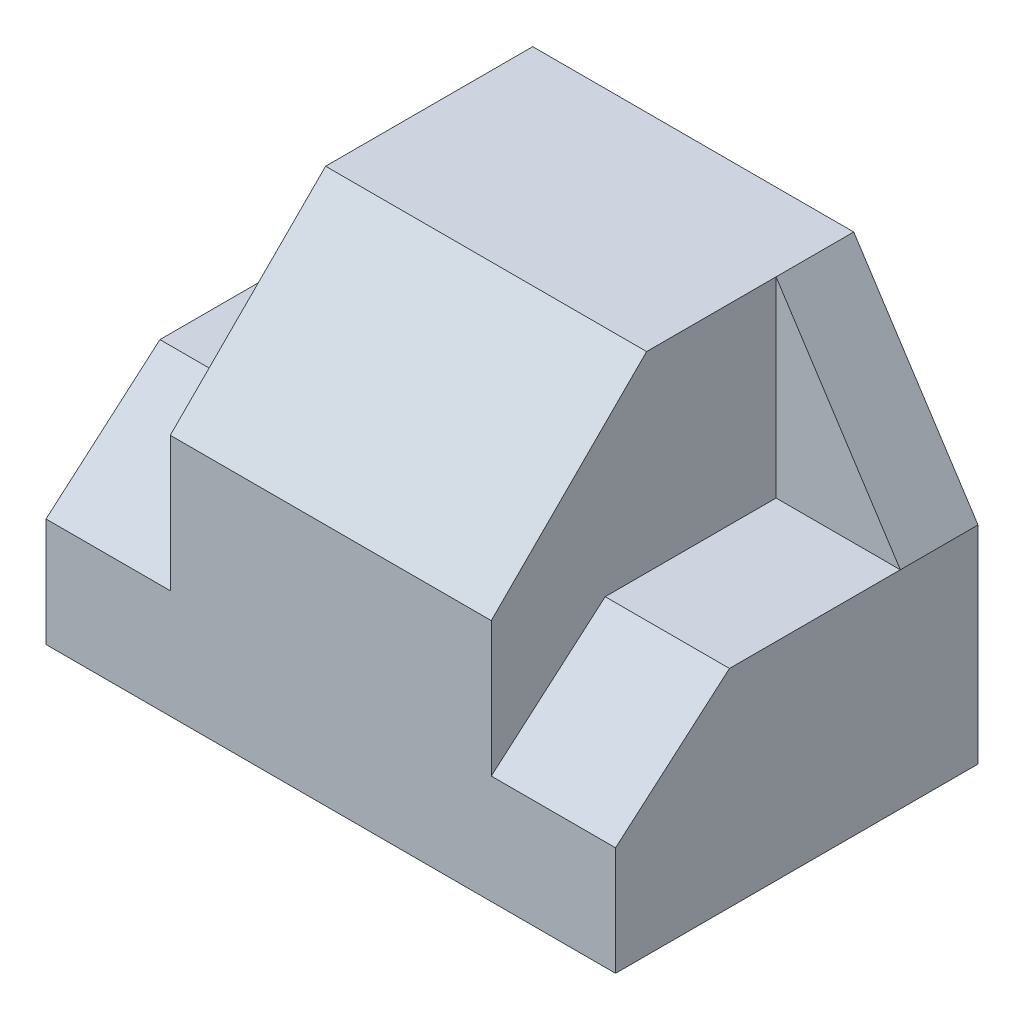
ISO-10303-21;
HEADER;
FILE_DESCRIPTION(('STEP AP214'),'2;1');
FILE_NAME('part.step','',(''),(''),'','','');
FILE_SCHEMA(('AUTOMOTIVE_DESIGN { 1 0 10303 214 1 1 1 1 }'));
ENDSEC;
DATA;
#1=APPLICATION_CONTEXT('core data for automotive mechanical design processes');
#2=APPLICATION_PROTOCOL_DEFINITION('international standard','automotive_design',2000,#1);
#3=PRODUCT_CONTEXT('',#1,'mechanical');
#4=PRODUCT('Part','Part','',(#3));
#5=PRODUCT_RELATED_PRODUCT_CATEGORY('part','',(#4));
#6=PRODUCT_DEFINITION_FORMATION('','',#4);
#7=PRODUCT_DEFINITION_CONTEXT('part definition',#1,'design');
#8=PRODUCT_DEFINITION('design','',#6,#7);
#9=PRODUCT_DEFINITION_SHAPE('','',#8);
#10=(LENGTH_UNIT() NAMED_UNIT(*) SI_UNIT(.MILLI.,.METRE.));
#11=(NAMED_UNIT(*) PLANE_ANGLE_UNIT() SI_UNIT($,.RADIAN.));
#12=(NAMED_UNIT(*) SI_UNIT($,.STERADIAN.) SOLID_ANGLE_UNIT());
#13=UNCERTAINTY_MEASURE_WITH_UNIT(LENGTH_MEASURE(1.E-05),#10,'distance_accuracy_value','');
#14=(GEOMETRIC_REPRESENTATION_CONTEXT(3) GLOBAL_UNCERTAINTY_ASSIGNED_CONTEXT((#13)) GLOBAL_UNIT_ASSIGNED_CONTEXT((#10,
#11,#12)) REPRESENTATION_CONTEXT('',''));
#15=CARTESIAN_POINT('',(0.,0.,0.));
#16=DIRECTION('',(0.,0.,1.));
#17=DIRECTION('',(1.,0.,0.));
#18=AXIS2_PLACEMENT_3D('',#15,#16,#17);
#19=CARTESIAN_POINT('',(31.,0.,70.));
#20=DIRECTION('',(-1.,0.,0.));
#21=DIRECTION('',(0.,0.,1.));
#22=AXIS2_PLACEMENT_3D('',#19,#20,#21);
#23=PLANE('',#22);
#24=DIRECTION('',(0.,-0.653619870346092,0.75682300776916));
#25=VECTOR('',#24,1.);
#26=CARTESIAN_POINT('',(31.,46.6556213017752,40.2934911242604));
#27=LINE('',#26,#25);
#28=CARTESIAN_POINT('',(31.,40.,48.));
#29=VERTEX_POINT('',#28);
#30=CARTESIAN_POINT('',(31.,21.,70.));
#31=VERTEX_POINT('',#30);
#32=EDGE_CURVE('E203',#29,#31,#27,.T.);
#33=ORIENTED_EDGE('',*,*,#32,.F.);
#34=DIRECTION('',(0.,0.,-1.));
#35=VECTOR('',#34,1.);
#36=CARTESIAN_POINT('',(31.,40.,48.));
#37=LINE('',#36,#35);
#38=CARTESIAN_POINT('',(31.,40.,15.));
#39=VERTEX_POINT('',#38);
#40=EDGE_CURVE('E245',#29,#39,#37,.T.);
#41=ORIENTED_EDGE('',*,*,#40,.T.);
#42=DIRECTION('',(0.,1.,0.));
#43=VECTOR('',#42,1.);
#44=CARTESIAN_POINT('',(31.,0.,15.));
#45=LINE('',#44,#43);
#46=CARTESIAN_POINT('',(31.,77.,15.));
#47=VERTEX_POINT('',#46);
#48=EDGE_CURVE('E221',#39,#47,#45,.T.);
#49=ORIENTED_EDGE('',*,*,#48,.T.);
#50=DIRECTION('',(0.,0.,-1.));
#51=VECTOR('',#50,1.);
#52=CARTESIAN_POINT('',(31.,77.,40.));
#53=LINE('',#52,#51);
#54=CARTESIAN_POINT('',(31.,77.,40.));
#55=VERTEX_POINT('',#54);
#56=EDGE_CURVE('E235',#55,#47,#53,.T.);
#57=ORIENTED_EDGE('',*,*,#56,.F.);
#58=DIRECTION('',(0.,-0.707106781186548,0.707106781186547));
#59=VECTOR('',#58,1.);
#60=CARTESIAN_POINT('',(31.,58.5,58.5));
#61=LINE('',#60,#59);
#62=CARTESIAN_POINT('',(31.,47.,70.));
#63=VERTEX_POINT('',#62);
#64=EDGE_CURVE('E196',#55,#63,#61,.T.);
#65=ORIENTED_EDGE('',*,*,#64,.T.);
#66=DIRECTION('',(0.,1.,0.));
#67=VECTOR('',#66,1.);
#68=CARTESIAN_POINT('',(31.,0.,70.));
#69=LINE('',#68,#67);
#70=EDGE_CURVE('E181',#31,#63,#69,.T.);
#71=ORIENTED_EDGE('',*,*,#70,.F.);
#72=EDGE_LOOP('',(#33,#41,#49,#57,#65,#71));
#73=FACE_BOUND('',#72,.T.);
#74=ADVANCED_FACE('F35',(#73),#23,.F.);
#75=CARTESIAN_POINT('',(0.,0.,70.));
#76=DIRECTION('',(0.,1.,0.));
#77=DIRECTION('',(0.,0.,1.));
#78=AXIS2_PLACEMENT_3D('',#75,#76,#77);
#79=PLANE('',#78);
#80=DIRECTION('',(1.,0.,0.));
#81=VECTOR('',#80,1.);
#82=CARTESIAN_POINT('',(0.,0.,0.));
#83=LINE('',#82,#81);
#84=CARTESIAN_POINT('',(-55.,0.,0.));
#85=VERTEX_POINT('',#84);
#86=CARTESIAN_POINT('',(55.,0.,0.));
#87=VERTEX_POINT('',#86);
#88=EDGE_CURVE('E158',#85,#87,#83,.T.);
#89=ORIENTED_EDGE('',*,*,#88,.T.);
#90=DIRECTION('',(0.,0.,-1.));
#91=VECTOR('',#90,1.);
#92=CARTESIAN_POINT('',(55.,0.,70.));
#93=LINE('',#92,#91);
#94=CARTESIAN_POINT('',(55.,0.,70.));
#95=VERTEX_POINT('',#94);
#96=EDGE_CURVE('E11',#95,#87,#93,.T.);
#97=ORIENTED_EDGE('',*,*,#96,.F.);
#98=DIRECTION('',(1.,0.,0.));
#99=VECTOR('',#98,1.);
#100=CARTESIAN_POINT('',(0.,0.,70.));
#101=LINE('',#100,#99);
#102=CARTESIAN_POINT('',(-55.,0.,70.));
#103=VERTEX_POINT('',#102);
#104=EDGE_CURVE('E167',#103,#95,#101,.T.);
#105=ORIENTED_EDGE('',*,*,#104,.F.);
#106=DIRECTION('',(0.,0.,-1.));
#107=VECTOR('',#106,1.);
#108=CARTESIAN_POINT('',(-55.,0.,70.));
#109=LINE('',#108,#107);
#110=EDGE_CURVE('E43',#103,#85,#109,.T.);
#111=ORIENTED_EDGE('',*,*,#110,.T.);
#112=EDGE_LOOP('',(#89,#97,#105,#111));
#113=FACE_BOUND('',#112,.T.);
#114=ADVANCED_FACE('F37',(#113),#79,.F.);
#115=CARTESIAN_POINT('',(55.,0.,70.));
#116=DIRECTION('',(-1.,0.,0.));
#117=DIRECTION('',(0.,0.,1.));
#118=AXIS2_PLACEMENT_3D('',#115,#116,#117);
#119=PLANE('',#118);
#120=DIRECTION('',(0.,1.,0.));
#121=VECTOR('',#120,1.);
#122=CARTESIAN_POINT('',(55.,0.,0.));
#123=LINE('',#122,#121);
#124=CARTESIAN_POINT('',(55.,40.,0.));
#125=VERTEX_POINT('',#124);
#126=EDGE_CURVE('E161',#87,#125,#123,.T.);
#127=ORIENTED_EDGE('',*,*,#126,.T.);
#128=DIRECTION('',(0.,0.,-1.));
#129=VECTOR('',#128,1.);
#130=CARTESIAN_POINT('',(55.,40.,15.));
#131=LINE('',#130,#129);
#132=CARTESIAN_POINT('',(55.,40.,15.));
#133=VERTEX_POINT('',#132);
#134=EDGE_CURVE('E228',#133,#125,#131,.T.);
#135=ORIENTED_EDGE('',*,*,#134,.F.);
#136=DIRECTION('',(0.,0.,-1.));
#137=VECTOR('',#136,1.);
#138=CARTESIAN_POINT('',(55.,40.,48.));
#139=LINE('',#138,#137);
#140=CARTESIAN_POINT('',(55.,40.,48.));
#141=VERTEX_POINT('',#140);
#142=EDGE_CURVE('E162',#141,#133,#139,.T.);
#143=ORIENTED_EDGE('',*,*,#142,.F.);
#144=DIRECTION('',(0.,-0.653619870346092,0.75682300776916));
#145=VECTOR('',#144,1.);
#146=CARTESIAN_POINT('',(55.,46.6556213017752,40.2934911242604));
#147=LINE('',#146,#145);
#148=CARTESIAN_POINT('',(55.,21.,70.));
#149=VERTEX_POINT('',#148);
#150=EDGE_CURVE('E200',#141,#149,#147,.T.);
#151=ORIENTED_EDGE('',*,*,#150,.T.);
#152=DIRECTION('',(0.,1.,0.));
#153=VECTOR('',#152,1.);
#154=CARTESIAN_POINT('',(55.,0.,70.));
#155=LINE('',#154,#153);
#156=EDGE_CURVE('E172',#95,#149,#155,.T.);
#157=ORIENTED_EDGE('',*,*,#156,.F.);
#158=ORIENTED_EDGE('',*,*,#96,.T.);
#159=EDGE_LOOP('',(#127,#135,#143,#151,#157,#158));
#160=FACE_BOUND('',#159,.T.);
#161=ADVANCED_FACE('F258',(#160),#119,.F.);
#162=CARTESIAN_POINT('',(-31.,0.,70.));
#163=DIRECTION('',(-1.,0.,0.));
#164=DIRECTION('',(0.,0.,1.));
#165=AXIS2_PLACEMENT_3D('',#162,#163,#164);
#166=PLANE('',#165);
#167=DIRECTION('',(0.,0.653619870346092,-0.75682300776916));
#168=VECTOR('',#167,1.);
#169=CARTESIAN_POINT('',(-31.,12.0284023668639,80.3881656804734));
#170=LINE('',#169,#168);
#171=CARTESIAN_POINT('',(-31.,21.,70.));
#172=VERTEX_POINT('',#171);
#173=CARTESIAN_POINT('',(-31.,40.,48.));
#174=VERTEX_POINT('',#173);
#175=EDGE_CURVE('E141',#172,#174,#170,.T.);
#176=ORIENTED_EDGE('',*,*,#175,.F.);
#177=DIRECTION('',(0.,1.,0.));
#178=VECTOR('',#177,1.);
#179=CARTESIAN_POINT('',(-31.,0.,70.));
#180=LINE('',#179,#178);
#181=CARTESIAN_POINT('',(-31.,47.,70.));
#182=VERTEX_POINT('',#181);
#183=EDGE_CURVE('E150',#172,#182,#180,.T.);
#184=ORIENTED_EDGE('',*,*,#183,.T.);
#185=DIRECTION('',(0.,-0.707106781186548,0.707106781186547));
#186=VECTOR('',#185,1.);
#187=CARTESIAN_POINT('',(-31.,58.5,58.5));
#188=LINE('',#187,#186);
#189=CARTESIAN_POINT('',(-31.,77.,40.));
#190=VERTEX_POINT('',#189);
#191=EDGE_CURVE('E187',#190,#182,#188,.T.);
#192=ORIENTED_EDGE('',*,*,#191,.F.);
#193=DIRECTION('',(0.,0.,-1.));
#194=VECTOR('',#193,1.);
#195=CARTESIAN_POINT('',(-31.,77.,40.));
#196=LINE('',#195,#194);
#197=CARTESIAN_POINT('',(-31.,77.,15.));
#198=VERTEX_POINT('',#197);
#199=EDGE_CURVE('E232',#190,#198,#196,.T.);
#200=ORIENTED_EDGE('',*,*,#199,.T.);
#201=DIRECTION('',(0.,1.,0.));
#202=VECTOR('',#201,1.);
#203=CARTESIAN_POINT('',(-31.,0.,15.));
#204=LINE('',#203,#202);
#205=CARTESIAN_POINT('',(-31.,40.,15.));
#206=VERTEX_POINT('',#205);
#207=EDGE_CURVE('E50',#206,#198,#204,.T.);
#208=ORIENTED_EDGE('',*,*,#207,.F.);
#209=DIRECTION('',(0.,0.,-1.));
#210=VECTOR('',#209,1.);
#211=CARTESIAN_POINT('',(-31.,40.,48.));
#212=LINE('',#211,#210);
#213=EDGE_CURVE('E239',#174,#206,#212,.T.);
#214=ORIENTED_EDGE('',*,*,#213,.F.);
#215=EDGE_LOOP('',(#176,#184,#192,#200,#208,#214));
#216=FACE_BOUND('',#215,.T.);
#217=ADVANCED_FACE('F186',(#216),#166,.T.);
#218=CARTESIAN_POINT('',(-55.,0.,70.));
#219=DIRECTION('',(-1.,0.,0.));
#220=DIRECTION('',(0.,0.,1.));
#221=AXIS2_PLACEMENT_3D('',#218,#219,#220);
#222=PLANE('',#221);
#223=DIRECTION('',(0.,1.,0.));
#224=VECTOR('',#223,1.);
#225=CARTESIAN_POINT('',(-55.,0.,0.));
#226=LINE('',#225,#224);
#227=CARTESIAN_POINT('',(-55.,40.,0.));
#228=VERTEX_POINT('',#227);
#229=EDGE_CURVE('E165',#85,#228,#226,.T.);
#230=ORIENTED_EDGE('',*,*,#229,.F.);
#231=ORIENTED_EDGE('',*,*,#110,.F.);
#232=DIRECTION('',(0.,1.,0.));
#233=VECTOR('',#232,1.);
#234=CARTESIAN_POINT('',(-55.,0.,70.));
#235=LINE('',#234,#233);
#236=CARTESIAN_POINT('',(-55.,21.,70.));
#237=VERTEX_POINT('',#236);
#238=EDGE_CURVE('E148',#103,#237,#235,.T.);
#239=ORIENTED_EDGE('',*,*,#238,.T.);
#240=DIRECTION('',(0.,-0.653619870346092,0.75682300776916));
#241=VECTOR('',#240,1.);
#242=CARTESIAN_POINT('',(-55.,40.,48.));
#243=LINE('',#242,#241);
#244=CARTESIAN_POINT('',(-55.,40.,48.));
#245=VERTEX_POINT('',#244);
#246=EDGE_CURVE('E132',#245,#237,#243,.T.);
#247=ORIENTED_EDGE('',*,*,#246,.F.);
#248=DIRECTION('',(0.,0.,-1.));
#249=VECTOR('',#248,1.);
#250=CARTESIAN_POINT('',(-55.,40.,48.));
#251=LINE('',#250,#249);
#252=CARTESIAN_POINT('',(-55.,40.,15.));
#253=VERTEX_POINT('',#252);
#254=EDGE_CURVE('E241',#245,#253,#251,.T.);
#255=ORIENTED_EDGE('',*,*,#254,.T.);
#256=DIRECTION('',(0.,0.,-1.));
#257=VECTOR('',#256,1.);
#258=CARTESIAN_POINT('',(-55.,40.,15.));
#259=LINE('',#258,#257);
#260=EDGE_CURVE('E213',#253,#228,#259,.T.);
#261=ORIENTED_EDGE('',*,*,#260,.T.);
#262=EDGE_LOOP('',(#230,#231,#239,#247,#255,#261));
#263=FACE_BOUND('',#262,.T.);
#264=ADVANCED_FACE('F153',(#263),#222,.T.);
#265=CARTESIAN_POINT('',(0.,0.,70.));
#266=DIRECTION('',(0.,0.,1.));
#267=DIRECTION('',(1.,0.,0.));
#268=AXIS2_PLACEMENT_3D('',#265,#266,#267);
#269=PLANE('',#268);
#270=ORIENTED_EDGE('',*,*,#183,.F.);
#271=DIRECTION('',(1.,0.,0.));
#272=VECTOR('',#271,1.);
#273=CARTESIAN_POINT('',(0.,21.,70.));
#274=LINE('',#273,#272);
#275=EDGE_CURVE('E135',#237,#172,#274,.T.);
#276=ORIENTED_EDGE('',*,*,#275,.F.);
#277=ORIENTED_EDGE('',*,*,#238,.F.);
#278=ORIENTED_EDGE('',*,*,#104,.T.);
#279=ORIENTED_EDGE('',*,*,#156,.T.);
#280=DIRECTION('',(-1.,0.,0.));
#281=VECTOR('',#280,1.);
#282=CARTESIAN_POINT('',(0.,21.,70.));
#283=LINE('',#282,#281);
#284=EDGE_CURVE('E175',#149,#31,#283,.T.);
#285=ORIENTED_EDGE('',*,*,#284,.T.);
#286=ORIENTED_EDGE('',*,*,#70,.T.);
#287=DIRECTION('',(-1.,0.,0.));
#288=VECTOR('',#287,1.);
#289=CARTESIAN_POINT('',(0.,47.,70.));
#290=LINE('',#289,#288);
#291=EDGE_CURVE('E183',#63,#182,#290,.T.);
#292=ORIENTED_EDGE('',*,*,#291,.T.);
#293=EDGE_LOOP('',(#270,#276,#277,#278,#279,#285,#286,#292));
#294=FACE_BOUND('',#293,.T.);
#295=ADVANCED_FACE('F146',(#294),#269,.T.);
#296=CARTESIAN_POINT('',(0.,0.,0.));
#297=DIRECTION('',(0.,0.,1.));
#298=DIRECTION('',(1.,0.,0.));
#299=AXIS2_PLACEMENT_3D('',#296,#297,#298);
#300=PLANE('',#299);
#301=DIRECTION('',(0.544191105099022,0.838961287027659,0.));
#302=VECTOR('',#301,1.);
#303=CARTESIAN_POINT('',(-56.974293059126,36.9562982005141,0.));
#304=LINE('',#303,#302);
#305=CARTESIAN_POINT('',(-31.,77.,0.));
#306=VERTEX_POINT('',#305);
#307=EDGE_CURVE('E195',#228,#306,#304,.T.);
#308=ORIENTED_EDGE('',*,*,#307,.T.);
#309=DIRECTION('',(-1.,0.,0.));
#310=VECTOR('',#309,1.);
#311=CARTESIAN_POINT('',(0.,77.,0.));
#312=LINE('',#311,#310);
#313=CARTESIAN_POINT('',(31.,77.,0.));
#314=VERTEX_POINT('',#313);
#315=EDGE_CURVE('E230',#314,#306,#312,.T.);
#316=ORIENTED_EDGE('',*,*,#315,.F.);
#317=DIRECTION('',(-0.544191105099022,0.838961287027659,0.));
#318=VECTOR('',#317,1.);
#319=CARTESIAN_POINT('',(56.974293059126,36.9562982005141,0.));
#320=LINE('',#319,#318);
#321=EDGE_CURVE('E215',#125,#314,#320,.T.);
#322=ORIENTED_EDGE('',*,*,#321,.F.);
#323=ORIENTED_EDGE('',*,*,#126,.F.);
#324=ORIENTED_EDGE('',*,*,#88,.F.);
#325=ORIENTED_EDGE('',*,*,#229,.T.);
#326=EDGE_LOOP('',(#308,#316,#322,#323,#324,#325));
#327=FACE_BOUND('',#326,.T.);
#328=ADVANCED_FACE('F265',(#327),#300,.F.);
#329=CARTESIAN_POINT('',(0.,40.,48.));
#330=DIRECTION('',(0.,-1.,0.));
#331=DIRECTION('',(0.,0.,-1.));
#332=AXIS2_PLACEMENT_3D('',#329,#330,#331);
#333=PLANE('',#332);
#334=ORIENTED_EDGE('',*,*,#142,.T.);
#335=DIRECTION('',(-1.,0.,0.));
#336=VECTOR('',#335,1.);
#337=CARTESIAN_POINT('',(0.,40.,15.));
#338=LINE('',#337,#336);
#339=EDGE_CURVE('E216',#133,#39,#338,.T.);
#340=ORIENTED_EDGE('',*,*,#339,.T.);
#341=ORIENTED_EDGE('',*,*,#40,.F.);
#342=DIRECTION('',(-1.,0.,0.));
#343=VECTOR('',#342,1.);
#344=CARTESIAN_POINT('',(0.,40.,48.));
#345=LINE('',#344,#343);
#346=EDGE_CURVE('E243',#141,#29,#345,.T.);
#347=ORIENTED_EDGE('',*,*,#346,.F.);
#348=EDGE_LOOP('',(#334,#340,#341,#347));
#349=FACE_BOUND('',#348,.T.);
#350=ADVANCED_FACE('F252',(#349),#333,.F.);
#351=CARTESIAN_POINT('',(0.,40.,48.));
#352=DIRECTION('',(0.,1.,0.));
#353=DIRECTION('',(0.,0.,1.));
#354=AXIS2_PLACEMENT_3D('',#351,#352,#353);
#355=PLANE('',#354);
#356=DIRECTION('',(1.,0.,0.));
#357=VECTOR('',#356,1.);
#358=CARTESIAN_POINT('',(0.,40.,15.));
#359=LINE('',#358,#357);
#360=EDGE_CURVE('E57',#253,#206,#359,.T.);
#361=ORIENTED_EDGE('',*,*,#360,.F.);
#362=ORIENTED_EDGE('',*,*,#254,.F.);
#363=DIRECTION('',(1.,0.,0.));
#364=VECTOR('',#363,1.);
#365=CARTESIAN_POINT('',(0.,40.,48.));
#366=LINE('',#365,#364);
#367=EDGE_CURVE('E138',#245,#174,#366,.T.);
#368=ORIENTED_EDGE('',*,*,#367,.T.);
#369=ORIENTED_EDGE('',*,*,#213,.T.);
#370=EDGE_LOOP('',(#361,#362,#368,#369));
#371=FACE_BOUND('',#370,.T.);
#372=ADVANCED_FACE('F308',(#371),#355,.T.);
#373=CARTESIAN_POINT('',(0.,77.,40.));
#374=DIRECTION('',(0.,-1.,0.));
#375=DIRECTION('',(0.,0.,-1.));
#376=AXIS2_PLACEMENT_3D('',#373,#374,#375);
#377=PLANE('',#376);
#378=ORIENTED_EDGE('',*,*,#315,.T.);
#379=DIRECTION('',(0.,0.,-1.));
#380=VECTOR('',#379,1.);
#381=CARTESIAN_POINT('',(-31.,77.,15.));
#382=LINE('',#381,#380);
#383=EDGE_CURVE('E209',#198,#306,#382,.T.);
#384=ORIENTED_EDGE('',*,*,#383,.F.);
#385=ORIENTED_EDGE('',*,*,#199,.F.);
#386=DIRECTION('',(-1.,0.,0.));
#387=VECTOR('',#386,1.);
#388=CARTESIAN_POINT('',(0.,77.,40.));
#389=LINE('',#388,#387);
#390=EDGE_CURVE('E194',#55,#190,#389,.T.);
#391=ORIENTED_EDGE('',*,*,#390,.F.);
#392=ORIENTED_EDGE('',*,*,#56,.T.);
#393=DIRECTION('',(0.,0.,-1.));
#394=VECTOR('',#393,1.);
#395=CARTESIAN_POINT('',(31.,77.,15.));
#396=LINE('',#395,#394);
#397=EDGE_CURVE('E224',#47,#314,#396,.T.);
#398=ORIENTED_EDGE('',*,*,#397,.T.);
#399=EDGE_LOOP('',(#378,#384,#385,#391,#392,#398));
#400=FACE_BOUND('',#399,.T.);
#401=ADVANCED_FACE('F267',(#400),#377,.F.);
#402=CARTESIAN_POINT('',(56.974293059126,36.9562982005141,15.));
#403=DIRECTION('',(-0.838961287027659,-0.544191105099022,0.));
#404=DIRECTION('',(0.544191105099022,-0.838961287027659,0.));
#405=AXIS2_PLACEMENT_3D('',#402,#403,#404);
#406=PLANE('',#405);
#407=ORIENTED_EDGE('',*,*,#321,.T.);
#408=ORIENTED_EDGE('',*,*,#397,.F.);
#409=DIRECTION('',(-0.544191105099022,0.838961287027659,0.));
#410=VECTOR('',#409,1.);
#411=CARTESIAN_POINT('',(56.974293059126,36.9562982005141,15.));
#412=LINE('',#411,#410);
#413=EDGE_CURVE('E219',#133,#47,#412,.T.);
#414=ORIENTED_EDGE('',*,*,#413,.F.);
#415=ORIENTED_EDGE('',*,*,#134,.T.);
#416=EDGE_LOOP('',(#407,#408,#414,#415));
#417=FACE_BOUND('',#416,.T.);
#418=ADVANCED_FACE('F262',(#417),#406,.F.);
#419=CARTESIAN_POINT('',(0.,0.,15.));
#420=DIRECTION('',(0.,0.,1.));
#421=DIRECTION('',(1.,0.,0.));
#422=AXIS2_PLACEMENT_3D('',#419,#420,#421);
#423=PLANE('',#422);
#424=ORIENTED_EDGE('',*,*,#339,.F.);
#425=ORIENTED_EDGE('',*,*,#413,.T.);
#426=ORIENTED_EDGE('',*,*,#48,.F.);
#427=EDGE_LOOP('',(#424,#425,#426));
#428=FACE_BOUND('',#427,.T.);
#429=ADVANCED_FACE('F282',(#428),#423,.T.);
#430=CARTESIAN_POINT('',(-56.974293059126,36.9562982005141,15.));
#431=DIRECTION('',(-0.838961287027659,0.544191105099022,0.));
#432=DIRECTION('',(-0.544191105099022,-0.838961287027659,0.));
#433=AXIS2_PLACEMENT_3D('',#430,#431,#432);
#434=PLANE('',#433);
#435=ORIENTED_EDGE('',*,*,#307,.F.);
#436=ORIENTED_EDGE('',*,*,#260,.F.);
#437=DIRECTION('',(0.544191105099022,0.838961287027659,0.));
#438=VECTOR('',#437,1.);
#439=CARTESIAN_POINT('',(-56.974293059126,36.9562982005141,15.));
#440=LINE('',#439,#438);
#441=EDGE_CURVE('E198',#253,#198,#440,.T.);
#442=ORIENTED_EDGE('',*,*,#441,.T.);
#443=ORIENTED_EDGE('',*,*,#383,.T.);
#444=EDGE_LOOP('',(#435,#436,#442,#443));
#445=FACE_BOUND('',#444,.T.);
#446=ADVANCED_FACE('F269',(#445),#434,.T.);
#447=CARTESIAN_POINT('',(0.,0.,15.));
#448=DIRECTION('',(0.,0.,1.));
#449=DIRECTION('',(1.,0.,0.));
#450=AXIS2_PLACEMENT_3D('',#447,#448,#449);
#451=PLANE('',#450);
#452=ORIENTED_EDGE('',*,*,#441,.F.);
#453=ORIENTED_EDGE('',*,*,#360,.T.);
#454=ORIENTED_EDGE('',*,*,#207,.T.);
#455=EDGE_LOOP('',(#452,#453,#454));
#456=FACE_BOUND('',#455,.T.);
#457=ADVANCED_FACE('F273',(#456),#451,.T.);
#458=CARTESIAN_POINT('',(-31.,58.5,58.5));
#459=DIRECTION('',(0.,0.707106781186547,0.707106781186548));
#460=DIRECTION('',(0.,-0.707106781186548,0.707106781186547));
#461=AXIS2_PLACEMENT_3D('',#458,#459,#460);
#462=PLANE('',#461);
#463=ORIENTED_EDGE('',*,*,#64,.F.);
#464=ORIENTED_EDGE('',*,*,#390,.T.);
#465=ORIENTED_EDGE('',*,*,#191,.T.);
#466=ORIENTED_EDGE('',*,*,#291,.F.);
#467=EDGE_LOOP('',(#463,#464,#465,#466));
#468=FACE_BOUND('',#467,.T.);
#469=ADVANCED_FACE('F192',(#468),#462,.T.);
#470=CARTESIAN_POINT('',(55.,46.6556213017752,40.2934911242604));
#471=DIRECTION('',(0.,-0.756823007769159,-0.653619870346092));
#472=DIRECTION('',(0.,0.653619870346092,-0.75682300776916));
#473=AXIS2_PLACEMENT_3D('',#470,#471,#472);
#474=PLANE('',#473);
#475=ORIENTED_EDGE('',*,*,#32,.T.);
#476=ORIENTED_EDGE('',*,*,#284,.F.);
#477=ORIENTED_EDGE('',*,*,#150,.F.);
#478=ORIENTED_EDGE('',*,*,#346,.T.);
#479=EDGE_LOOP('',(#475,#476,#477,#478));
#480=FACE_BOUND('',#479,.T.);
#481=ADVANCED_FACE('F280',(#480),#474,.F.);
#482=CARTESIAN_POINT('',(-55.,40.,48.));
#483=DIRECTION('',(0.,0.75682300776916,0.653619870346092));
#484=DIRECTION('',(0.,-0.653619870346092,0.75682300776916));
#485=AXIS2_PLACEMENT_3D('',#482,#483,#484);
#486=PLANE('',#485);
#487=ORIENTED_EDGE('',*,*,#275,.T.);
#488=ORIENTED_EDGE('',*,*,#175,.T.);
#489=ORIENTED_EDGE('',*,*,#367,.F.);
#490=ORIENTED_EDGE('',*,*,#246,.T.);
#491=EDGE_LOOP('',(#487,#488,#489,#490));
#492=FACE_BOUND('',#491,.T.);
#493=ADVANCED_FACE('F134',(#492),#486,.T.);
#494=CLOSED_SHELL('',(#74,#114,#161,#217,#264,#295,#328,#350,#372,#401,#418,#429,#446,#457,#469,
#481,#493));
#495=MANIFOLD_SOLID_BREP('B2',#494);
#496=ADVANCED_BREP_SHAPE_REPRESENTATION('',(#18,#495),#14);
#497=SHAPE_DEFINITION_REPRESENTATION(#9,#496);
ENDSEC;
END-ISO-10303-21;
